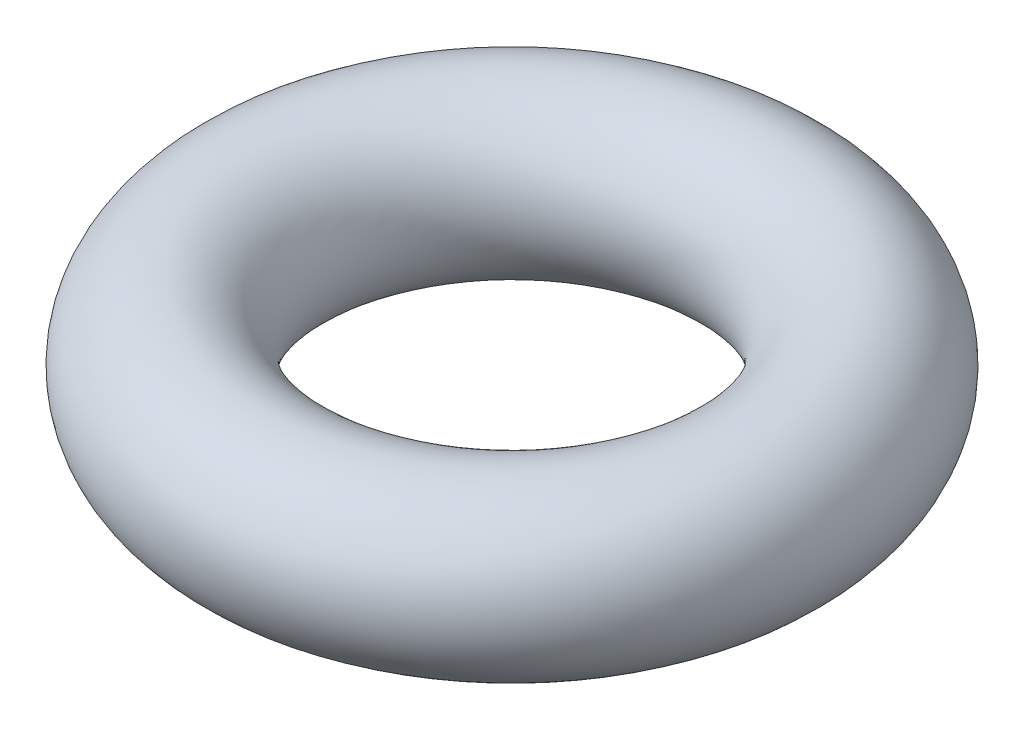
ISO-10303-21;
HEADER;
FILE_DESCRIPTION(('STEP AP214'),'2;1');
FILE_NAME('part.step','',(''),(''),'','','');
FILE_SCHEMA(('AUTOMOTIVE_DESIGN { 1 0 10303 214 1 1 1 1 }'));
ENDSEC;
DATA;
#1=APPLICATION_CONTEXT('core data for automotive mechanical design processes');
#2=APPLICATION_PROTOCOL_DEFINITION('international standard','automotive_design',2000,#1);
#3=PRODUCT_CONTEXT('',#1,'mechanical');
#4=PRODUCT('Part','Part','',(#3));
#5=PRODUCT_RELATED_PRODUCT_CATEGORY('part','',(#4));
#6=PRODUCT_DEFINITION_FORMATION('','',#4);
#7=PRODUCT_DEFINITION_CONTEXT('part definition',#1,'design');
#8=PRODUCT_DEFINITION('design','',#6,#7);
#9=PRODUCT_DEFINITION_SHAPE('','',#8);
#10=(LENGTH_UNIT() NAMED_UNIT(*) SI_UNIT(.MILLI.,.METRE.));
#11=(NAMED_UNIT(*) PLANE_ANGLE_UNIT() SI_UNIT($,.RADIAN.));
#12=(NAMED_UNIT(*) SI_UNIT($,.STERADIAN.) SOLID_ANGLE_UNIT());
#13=UNCERTAINTY_MEASURE_WITH_UNIT(LENGTH_MEASURE(1.E-05),#10,'distance_accuracy_value','');
#14=(GEOMETRIC_REPRESENTATION_CONTEXT(3) GLOBAL_UNCERTAINTY_ASSIGNED_CONTEXT((#13)) GLOBAL_UNIT_ASSIGNED_CONTEXT((#10,
#11,#12)) REPRESENTATION_CONTEXT('',''));
#15=CARTESIAN_POINT('',(0.,0.,0.));
#16=DIRECTION('',(0.,0.,1.));
#17=DIRECTION('',(1.,0.,0.));
#18=AXIS2_PLACEMENT_3D('',#15,#16,#17);
#19=CARTESIAN_POINT('',(0.,0.,0.));
#20=DIRECTION('',(0.,1.,0.));
#21=DIRECTION('',(-1.,0.,0.));
#22=AXIS2_PLACEMENT_3D('',#19,#20,#21);
#23=TOROIDAL_SURFACE('',#22,3.,1.);
#24=CARTESIAN_POINT('',(-4.,0.,0.));
#25=VERTEX_POINT('',#24);
#26=VERTEX_LOOP('',#25);
#27=FACE_BOUND('',#26,.T.);
#28=ADVANCED_FACE('F33',(#27),#23,.T.);
#29=CLOSED_SHELL('',(#28));
#30=MANIFOLD_SOLID_BREP('B2',#29);
#31=ADVANCED_BREP_SHAPE_REPRESENTATION('',(#18,#30),#14);
#32=SHAPE_DEFINITION_REPRESENTATION(#9,#31);
ENDSEC;
END-ISO-10303-21;
